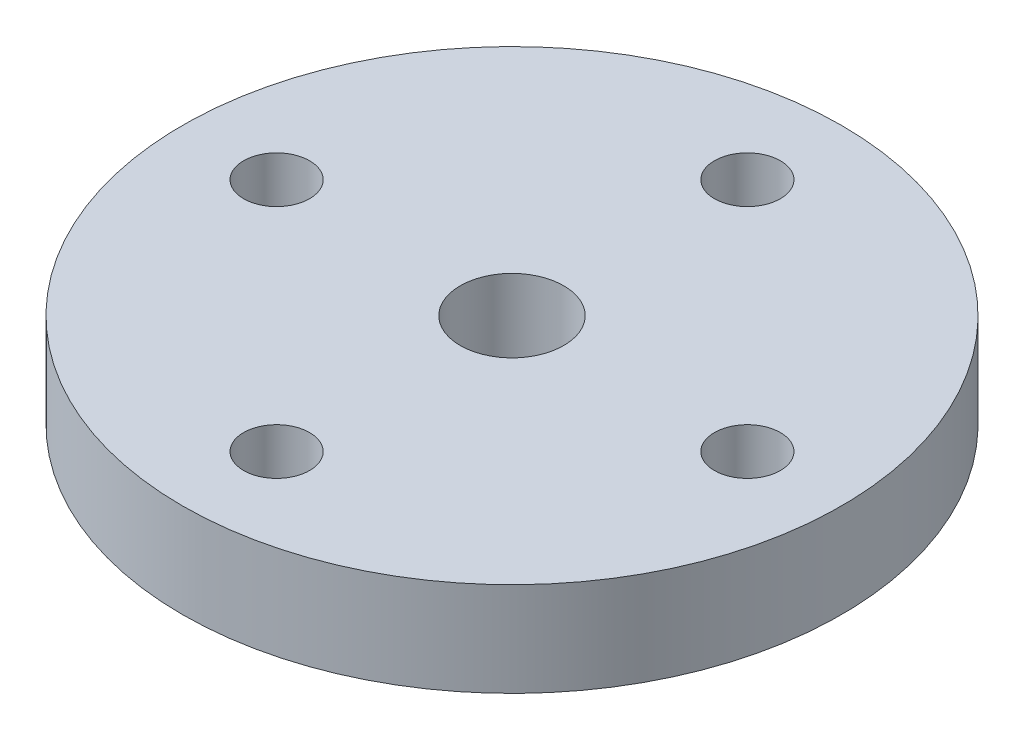
ISO-10303-21;
HEADER;
FILE_DESCRIPTION(('STEP AP214'),'2;1');
FILE_NAME('part.step','',(''),(''),'','','');
FILE_SCHEMA(('AUTOMOTIVE_DESIGN { 1 0 10303 214 1 1 1 1 }'));
ENDSEC;
DATA;
#1=APPLICATION_CONTEXT('core data for automotive mechanical design processes');
#2=APPLICATION_PROTOCOL_DEFINITION('international standard','automotive_design',2000,#1);
#3=PRODUCT_CONTEXT('',#1,'mechanical');
#4=PRODUCT('Part','Part','',(#3));
#5=PRODUCT_RELATED_PRODUCT_CATEGORY('part','',(#4));
#6=PRODUCT_DEFINITION_FORMATION('','',#4);
#7=PRODUCT_DEFINITION_CONTEXT('part definition',#1,'design');
#8=PRODUCT_DEFINITION('design','',#6,#7);
#9=PRODUCT_DEFINITION_SHAPE('','',#8);
#10=(LENGTH_UNIT() NAMED_UNIT(*) SI_UNIT(.MILLI.,.METRE.));
#11=(NAMED_UNIT(*) PLANE_ANGLE_UNIT() SI_UNIT($,.RADIAN.));
#12=(NAMED_UNIT(*) SI_UNIT($,.STERADIAN.) SOLID_ANGLE_UNIT());
#13=UNCERTAINTY_MEASURE_WITH_UNIT(LENGTH_MEASURE(1.E-05),#10,'distance_accuracy_value','');
#14=(GEOMETRIC_REPRESENTATION_CONTEXT(3) GLOBAL_UNCERTAINTY_ASSIGNED_CONTEXT((#13)) GLOBAL_UNIT_ASSIGNED_CONTEXT((#10,
#11,#12)) REPRESENTATION_CONTEXT('',''));
#15=CARTESIAN_POINT('',(0.,0.,0.));
#16=DIRECTION('',(0.,0.,1.));
#17=DIRECTION('',(1.,0.,0.));
#18=AXIS2_PLACEMENT_3D('',#15,#16,#17);
#19=CARTESIAN_POINT('',(0.,3.,0.));
#20=DIRECTION('',(0.,1.,0.));
#21=DIRECTION('',(0.,0.,1.));
#22=AXIS2_PLACEMENT_3D('',#19,#20,#21);
#23=PLANE('',#22);
#24=CARTESIAN_POINT('',(7.5,3.,0.));
#25=DIRECTION('',(0.,1.,0.));
#26=DIRECTION('',(0.,0.,1.));
#27=AXIS2_PLACEMENT_3D('',#24,#25,#26);
#28=CIRCLE('',#27,1.05);
#29=CARTESIAN_POINT('',(7.5,3.,1.05));
#30=VERTEX_POINT('',#29);
#31=EDGE_CURVE('E76',#30,#30,#28,.T.);
#32=ORIENTED_EDGE('',*,*,#31,.F.);
#33=EDGE_LOOP('',(#32));
#34=FACE_BOUND('',#33,.T.);
#35=CARTESIAN_POINT('',(-7.5,3.,0.));
#36=DIRECTION('',(0.,1.,0.));
#37=DIRECTION('',(0.,0.,1.));
#38=AXIS2_PLACEMENT_3D('',#35,#36,#37);
#39=CIRCLE('',#38,1.05);
#40=CARTESIAN_POINT('',(-7.5,3.,1.05));
#41=VERTEX_POINT('',#40);
#42=EDGE_CURVE('E61',#41,#41,#39,.T.);
#43=ORIENTED_EDGE('',*,*,#42,.F.);
#44=EDGE_LOOP('',(#43));
#45=FACE_BOUND('',#44,.T.);
#46=CARTESIAN_POINT('',(0.,3.,0.));
#47=DIRECTION('',(0.,1.,0.));
#48=DIRECTION('',(0.,0.,1.));
#49=AXIS2_PLACEMENT_3D('',#46,#47,#48);
#50=CIRCLE('',#49,10.5);
#51=CARTESIAN_POINT('',(0.,3.,10.5));
#52=VERTEX_POINT('',#51);
#53=EDGE_CURVE('E10',#52,#52,#50,.T.);
#54=ORIENTED_EDGE('',*,*,#53,.T.);
#55=EDGE_LOOP('',(#54));
#56=FACE_BOUND('',#55,.T.);
#57=CARTESIAN_POINT('',(0.,3.,0.));
#58=DIRECTION('',(0.,1.,0.));
#59=DIRECTION('',(0.,0.,1.));
#60=AXIS2_PLACEMENT_3D('',#57,#58,#59);
#61=CIRCLE('',#60,1.65);
#62=CARTESIAN_POINT('',(0.,3.,1.65));
#63=VERTEX_POINT('',#62);
#64=EDGE_CURVE('E56',#63,#63,#61,.T.);
#65=ORIENTED_EDGE('',*,*,#64,.F.);
#66=EDGE_LOOP('',(#65));
#67=FACE_BOUND('',#66,.T.);
#68=CARTESIAN_POINT('',(0.,3.,-7.5));
#69=DIRECTION('',(0.,1.,0.));
#70=DIRECTION('',(0.,0.,1.));
#71=AXIS2_PLACEMENT_3D('',#68,#69,#70);
#72=CIRCLE('',#71,1.05);
#73=CARTESIAN_POINT('',(0.,3.,-6.45));
#74=VERTEX_POINT('',#73);
#75=EDGE_CURVE('E68',#74,#74,#72,.T.);
#76=ORIENTED_EDGE('',*,*,#75,.F.);
#77=EDGE_LOOP('',(#76));
#78=FACE_BOUND('',#77,.T.);
#79=CARTESIAN_POINT('',(0.,3.,7.5));
#80=DIRECTION('',(0.,1.,0.));
#81=DIRECTION('',(0.,0.,1.));
#82=AXIS2_PLACEMENT_3D('',#79,#80,#81);
#83=CIRCLE('',#82,1.05);
#84=CARTESIAN_POINT('',(0.,3.,8.55));
#85=VERTEX_POINT('',#84);
#86=EDGE_CURVE('E84',#85,#85,#83,.T.);
#87=ORIENTED_EDGE('',*,*,#86,.F.);
#88=EDGE_LOOP('',(#87));
#89=FACE_BOUND('',#88,.T.);
#90=ADVANCED_FACE('F41',(#34,#45,#56,#67,#78,#89),#23,.T.);
#91=CARTESIAN_POINT('',(0.,0.,0.));
#92=DIRECTION('',(0.,1.,0.));
#93=DIRECTION('',(0.,0.,1.));
#94=AXIS2_PLACEMENT_3D('',#91,#92,#93);
#95=PLANE('',#94);
#96=CARTESIAN_POINT('',(0.,0.,0.));
#97=DIRECTION('',(0.,1.,0.));
#98=DIRECTION('',(0.,0.,1.));
#99=AXIS2_PLACEMENT_3D('',#96,#97,#98);
#100=CIRCLE('',#99,10.5);
#101=CARTESIAN_POINT('',(0.,0.,10.5));
#102=VERTEX_POINT('',#101);
#103=EDGE_CURVE('E45',#102,#102,#100,.T.);
#104=ORIENTED_EDGE('',*,*,#103,.F.);
#105=EDGE_LOOP('',(#104));
#106=FACE_BOUND('',#105,.T.);
#107=CARTESIAN_POINT('',(0.,0.,0.));
#108=DIRECTION('',(0.,1.,0.));
#109=DIRECTION('',(0.,0.,1.));
#110=AXIS2_PLACEMENT_3D('',#107,#108,#109);
#111=CIRCLE('',#110,1.65);
#112=CARTESIAN_POINT('',(0.,0.,1.65));
#113=VERTEX_POINT('',#112);
#114=EDGE_CURVE('E58',#113,#113,#111,.T.);
#115=ORIENTED_EDGE('',*,*,#114,.T.);
#116=EDGE_LOOP('',(#115));
#117=FACE_BOUND('',#116,.T.);
#118=CARTESIAN_POINT('',(-7.5,0.,0.));
#119=DIRECTION('',(0.,1.,0.));
#120=DIRECTION('',(0.,0.,1.));
#121=AXIS2_PLACEMENT_3D('',#118,#119,#120);
#122=CIRCLE('',#121,1.05);
#123=CARTESIAN_POINT('',(-7.5,0.,1.05));
#124=VERTEX_POINT('',#123);
#125=EDGE_CURVE('E65',#124,#124,#122,.T.);
#126=ORIENTED_EDGE('',*,*,#125,.T.);
#127=EDGE_LOOP('',(#126));
#128=FACE_BOUND('',#127,.T.);
#129=CARTESIAN_POINT('',(0.,0.,-7.5));
#130=DIRECTION('',(0.,1.,0.));
#131=DIRECTION('',(0.,0.,1.));
#132=AXIS2_PLACEMENT_3D('',#129,#130,#131);
#133=CIRCLE('',#132,1.05);
#134=CARTESIAN_POINT('',(0.,0.,-6.45));
#135=VERTEX_POINT('',#134);
#136=EDGE_CURVE('E72',#135,#135,#133,.T.);
#137=ORIENTED_EDGE('',*,*,#136,.T.);
#138=EDGE_LOOP('',(#137));
#139=FACE_BOUND('',#138,.T.);
#140=CARTESIAN_POINT('',(7.5,0.,0.));
#141=DIRECTION('',(0.,1.,0.));
#142=DIRECTION('',(0.,0.,1.));
#143=AXIS2_PLACEMENT_3D('',#140,#141,#142);
#144=CIRCLE('',#143,1.05);
#145=CARTESIAN_POINT('',(7.5,0.,1.05));
#146=VERTEX_POINT('',#145);
#147=EDGE_CURVE('E80',#146,#146,#144,.T.);
#148=ORIENTED_EDGE('',*,*,#147,.T.);
#149=EDGE_LOOP('',(#148));
#150=FACE_BOUND('',#149,.T.);
#151=CARTESIAN_POINT('',(0.,0.,7.5));
#152=DIRECTION('',(0.,1.,0.));
#153=DIRECTION('',(0.,0.,1.));
#154=AXIS2_PLACEMENT_3D('',#151,#152,#153);
#155=CIRCLE('',#154,1.05);
#156=CARTESIAN_POINT('',(0.,0.,8.55));
#157=VERTEX_POINT('',#156);
#158=EDGE_CURVE('E88',#157,#157,#155,.T.);
#159=ORIENTED_EDGE('',*,*,#158,.T.);
#160=EDGE_LOOP('',(#159));
#161=FACE_BOUND('',#160,.T.);
#162=ADVANCED_FACE('F100',(#106,#117,#128,#139,#150,#161),#95,.F.);
#163=CARTESIAN_POINT('',(0.,3.,0.));
#164=DIRECTION('',(0.,-1.,0.));
#165=DIRECTION('',(0.,0.,-1.));
#166=AXIS2_PLACEMENT_3D('',#163,#164,#165);
#167=CYLINDRICAL_SURFACE('',#166,10.5);
#168=ORIENTED_EDGE('',*,*,#53,.F.);
#169=EDGE_LOOP('',(#168));
#170=FACE_BOUND('',#169,.T.);
#171=ORIENTED_EDGE('',*,*,#103,.T.);
#172=EDGE_LOOP('',(#171));
#173=FACE_BOUND('',#172,.T.);
#174=ADVANCED_FACE('F43',(#170,#173),#167,.T.);
#175=CARTESIAN_POINT('',(0.,3.,0.));
#176=DIRECTION('',(0.,-1.,0.));
#177=DIRECTION('',(0.,0.,-1.));
#178=AXIS2_PLACEMENT_3D('',#175,#176,#177);
#179=CYLINDRICAL_SURFACE('',#178,1.65);
#180=ORIENTED_EDGE('',*,*,#64,.T.);
#181=EDGE_LOOP('',(#180));
#182=FACE_BOUND('',#181,.T.);
#183=ORIENTED_EDGE('',*,*,#114,.F.);
#184=EDGE_LOOP('',(#183));
#185=FACE_BOUND('',#184,.T.);
#186=ADVANCED_FACE('F109',(#182,#185),#179,.F.);
#187=CARTESIAN_POINT('',(-7.5,3.,0.));
#188=DIRECTION('',(0.,-1.,0.));
#189=DIRECTION('',(0.,0.,-1.));
#190=AXIS2_PLACEMENT_3D('',#187,#188,#189);
#191=CYLINDRICAL_SURFACE('',#190,1.05);
#192=ORIENTED_EDGE('',*,*,#42,.T.);
#193=EDGE_LOOP('',(#192));
#194=FACE_BOUND('',#193,.T.);
#195=ORIENTED_EDGE('',*,*,#125,.F.);
#196=EDGE_LOOP('',(#195));
#197=FACE_BOUND('',#196,.T.);
#198=ADVANCED_FACE('F112',(#194,#197),#191,.F.);
#199=CARTESIAN_POINT('',(0.,3.,-7.5));
#200=DIRECTION('',(0.,-1.,0.));
#201=DIRECTION('',(0.,0.,-1.));
#202=AXIS2_PLACEMENT_3D('',#199,#200,#201);
#203=CYLINDRICAL_SURFACE('',#202,1.05);
#204=ORIENTED_EDGE('',*,*,#75,.T.);
#205=EDGE_LOOP('',(#204));
#206=FACE_BOUND('',#205,.T.);
#207=ORIENTED_EDGE('',*,*,#136,.F.);
#208=EDGE_LOOP('',(#207));
#209=FACE_BOUND('',#208,.T.);
#210=ADVANCED_FACE('F116',(#206,#209),#203,.F.);
#211=CARTESIAN_POINT('',(7.5,3.,0.));
#212=DIRECTION('',(0.,-1.,0.));
#213=DIRECTION('',(0.,0.,-1.));
#214=AXIS2_PLACEMENT_3D('',#211,#212,#213);
#215=CYLINDRICAL_SURFACE('',#214,1.05);
#216=ORIENTED_EDGE('',*,*,#31,.T.);
#217=EDGE_LOOP('',(#216));
#218=FACE_BOUND('',#217,.T.);
#219=ORIENTED_EDGE('',*,*,#147,.F.);
#220=EDGE_LOOP('',(#219));
#221=FACE_BOUND('',#220,.T.);
#222=ADVANCED_FACE('F120',(#218,#221),#215,.F.);
#223=CARTESIAN_POINT('',(0.,3.,7.5));
#224=DIRECTION('',(0.,-1.,0.));
#225=DIRECTION('',(0.,0.,-1.));
#226=AXIS2_PLACEMENT_3D('',#223,#224,#225);
#227=CYLINDRICAL_SURFACE('',#226,1.05);
#228=ORIENTED_EDGE('',*,*,#86,.T.);
#229=EDGE_LOOP('',(#228));
#230=FACE_BOUND('',#229,.T.);
#231=ORIENTED_EDGE('',*,*,#158,.F.);
#232=EDGE_LOOP('',(#231));
#233=FACE_BOUND('',#232,.T.);
#234=ADVANCED_FACE('F96',(#230,#233),#227,.F.);
#235=CLOSED_SHELL('',(#90,#162,#174,#186,#198,#210,#222,#234));
#236=MANIFOLD_SOLID_BREP('B2',#235);
#237=ADVANCED_BREP_SHAPE_REPRESENTATION('',(#18,#236),#14);
#238=SHAPE_DEFINITION_REPRESENTATION(#9,#237);
ENDSEC;
END-ISO-10303-21;
